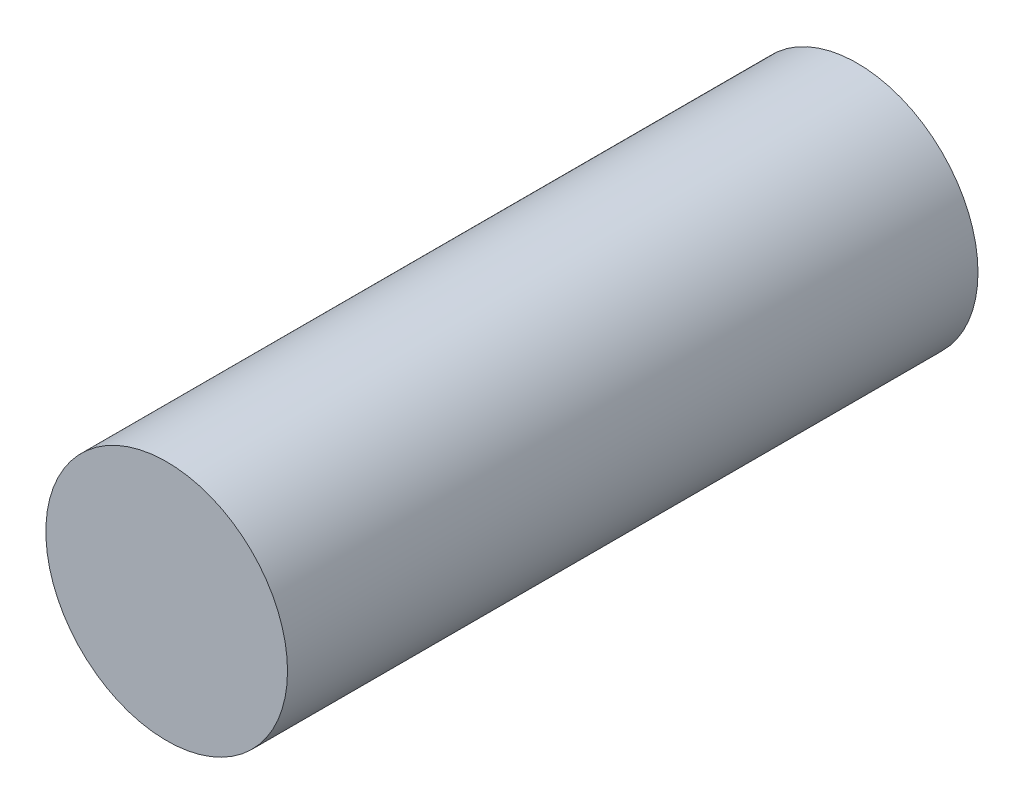
ISO-10303-21;
HEADER;
FILE_DESCRIPTION(('STEP AP214'),'2;1');
FILE_NAME('part.step','',(''),(''),'','','');
FILE_SCHEMA(('AUTOMOTIVE_DESIGN { 1 0 10303 214 1 1 1 1 }'));
ENDSEC;
DATA;
#1=APPLICATION_CONTEXT('core data for automotive mechanical design processes');
#2=APPLICATION_PROTOCOL_DEFINITION('international standard','automotive_design',2000,#1);
#3=PRODUCT_CONTEXT('',#1,'mechanical');
#4=PRODUCT('Part','Part','',(#3));
#5=PRODUCT_RELATED_PRODUCT_CATEGORY('part','',(#4));
#6=PRODUCT_DEFINITION_FORMATION('','',#4);
#7=PRODUCT_DEFINITION_CONTEXT('part definition',#1,'design');
#8=PRODUCT_DEFINITION('design','',#6,#7);
#9=PRODUCT_DEFINITION_SHAPE('','',#8);
#10=(LENGTH_UNIT() NAMED_UNIT(*) SI_UNIT(.MILLI.,.METRE.));
#11=(NAMED_UNIT(*) PLANE_ANGLE_UNIT() SI_UNIT($,.RADIAN.));
#12=(NAMED_UNIT(*) SI_UNIT($,.STERADIAN.) SOLID_ANGLE_UNIT());
#13=UNCERTAINTY_MEASURE_WITH_UNIT(LENGTH_MEASURE(1.E-05),#10,'distance_accuracy_value','');
#14=(GEOMETRIC_REPRESENTATION_CONTEXT(3) GLOBAL_UNCERTAINTY_ASSIGNED_CONTEXT((#13)) GLOBAL_UNIT_ASSIGNED_CONTEXT((#10,
#11,#12)) REPRESENTATION_CONTEXT('',''));
#15=CARTESIAN_POINT('',(0.,0.,0.));
#16=DIRECTION('',(0.,0.,1.));
#17=DIRECTION('',(1.,0.,0.));
#18=AXIS2_PLACEMENT_3D('',#15,#16,#17);
#19=CARTESIAN_POINT('',(0.,0.,20.));
#20=DIRECTION('',(0.,0.,-1.));
#21=DIRECTION('',(-1.,0.,0.));
#22=AXIS2_PLACEMENT_3D('',#19,#20,#21);
#23=CYLINDRICAL_SURFACE('',#22,3.5);
#24=CARTESIAN_POINT('',(0.,0.,20.));
#25=DIRECTION('',(0.,0.,1.));
#26=DIRECTION('',(1.,0.,0.));
#27=AXIS2_PLACEMENT_3D('',#24,#25,#26);
#28=CIRCLE('',#27,3.5);
#29=CARTESIAN_POINT('',(3.5,0.,20.));
#30=VERTEX_POINT('',#29);
#31=EDGE_CURVE('E11',#30,#30,#28,.T.);
#32=ORIENTED_EDGE('',*,*,#31,.F.);
#33=EDGE_LOOP('',(#32));
#34=FACE_BOUND('',#33,.T.);
#35=CARTESIAN_POINT('',(0.,0.,0.));
#36=DIRECTION('',(0.,0.,1.));
#37=DIRECTION('',(1.,0.,0.));
#38=AXIS2_PLACEMENT_3D('',#35,#36,#37);
#39=CIRCLE('',#38,3.5);
#40=CARTESIAN_POINT('',(3.5,0.,0.));
#41=VERTEX_POINT('',#40);
#42=EDGE_CURVE('E36',#41,#41,#39,.T.);
#43=ORIENTED_EDGE('',*,*,#42,.T.);
#44=EDGE_LOOP('',(#43));
#45=FACE_BOUND('',#44,.T.);
#46=ADVANCED_FACE('F33',(#34,#45),#23,.T.);
#47=CARTESIAN_POINT('',(0.,0.,20.));
#48=DIRECTION('',(0.,0.,1.));
#49=DIRECTION('',(1.,0.,0.));
#50=AXIS2_PLACEMENT_3D('',#47,#48,#49);
#51=PLANE('',#50);
#52=ORIENTED_EDGE('',*,*,#31,.T.);
#53=EDGE_LOOP('',(#52));
#54=FACE_BOUND('',#53,.T.);
#55=ADVANCED_FACE('F86',(#54),#51,.T.);
#56=CARTESIAN_POINT('',(0.,0.,0.));
#57=DIRECTION('',(0.,0.,1.));
#58=DIRECTION('',(1.,0.,0.));
#59=AXIS2_PLACEMENT_3D('',#56,#57,#58);
#60=PLANE('',#59);
#61=DIRECTION('',(1.,0.,0.));
#62=VECTOR('',#61,1.);
#63=CARTESIAN_POINT('',(1.39824890488067,1.43,0.));
#64=LINE('',#63,#62);
#65=CARTESIAN_POINT('',(-1.39824890488067,1.43,0.));
#66=VERTEX_POINT('',#65);
#67=CARTESIAN_POINT('',(1.39824890488067,1.43,0.));
#68=VERTEX_POINT('',#67);
#69=EDGE_CURVE('E66',#66,#68,#64,.T.);
#70=ORIENTED_EDGE('',*,*,#69,.F.);
#71=CARTESIAN_POINT('',(0.,0.,0.));
#72=DIRECTION('',(0.,0.,-1.));
#73=DIRECTION('',(-1.,0.,0.));
#74=AXIS2_PLACEMENT_3D('',#71,#72,#73);
#75=CIRCLE('',#74,2.);
#76=EDGE_CURVE('E47',#68,#66,#75,.T.);
#77=ORIENTED_EDGE('',*,*,#76,.F.);
#78=EDGE_LOOP('',(#70,#77));
#79=FACE_BOUND('',#78,.T.);
#80=ORIENTED_EDGE('',*,*,#42,.F.);
#81=EDGE_LOOP('',(#80));
#82=FACE_BOUND('',#81,.T.);
#83=ADVANCED_FACE('F70',(#79,#82),#60,.F.);
#84=CARTESIAN_POINT('',(0.,0.,10.));
#85=DIRECTION('',(0.,0.,-1.));
#86=DIRECTION('',(-1.,0.,0.));
#87=AXIS2_PLACEMENT_3D('',#84,#85,#86);
#88=CYLINDRICAL_SURFACE('',#87,2.);
#89=ORIENTED_EDGE('',*,*,#76,.T.);
#90=DIRECTION('',(0.,0.,-1.));
#91=VECTOR('',#90,1.);
#92=CARTESIAN_POINT('',(-1.39824890488067,1.43,10.));
#93=LINE('',#92,#91);
#94=CARTESIAN_POINT('',(-1.39824890488067,1.43,10.));
#95=VERTEX_POINT('',#94);
#96=EDGE_CURVE('E63',#95,#66,#93,.T.);
#97=ORIENTED_EDGE('',*,*,#96,.F.);
#98=CARTESIAN_POINT('',(0.,0.,10.));
#99=DIRECTION('',(0.,0.,-1.));
#100=DIRECTION('',(-1.,0.,0.));
#101=AXIS2_PLACEMENT_3D('',#98,#99,#100);
#102=CIRCLE('',#101,2.);
#103=CARTESIAN_POINT('',(1.39824890488067,1.43,10.));
#104=VERTEX_POINT('',#103);
#105=EDGE_CURVE('E61',#104,#95,#102,.T.);
#106=ORIENTED_EDGE('',*,*,#105,.F.);
#107=DIRECTION('',(0.,0.,-1.));
#108=VECTOR('',#107,1.);
#109=CARTESIAN_POINT('',(1.39824890488067,1.43,10.));
#110=LINE('',#109,#108);
#111=EDGE_CURVE('E55',#104,#68,#110,.T.);
#112=ORIENTED_EDGE('',*,*,#111,.T.);
#113=EDGE_LOOP('',(#89,#97,#106,#112));
#114=FACE_BOUND('',#113,.T.);
#115=ADVANCED_FACE('F59',(#114),#88,.F.);
#116=CARTESIAN_POINT('',(1.39824890488067,1.43,10.));
#117=DIRECTION('',(0.,1.,0.));
#118=DIRECTION('',(0.,0.,1.));
#119=AXIS2_PLACEMENT_3D('',#116,#117,#118);
#120=PLANE('',#119);
#121=ORIENTED_EDGE('',*,*,#69,.T.);
#122=ORIENTED_EDGE('',*,*,#111,.F.);
#123=DIRECTION('',(1.,0.,0.));
#124=VECTOR('',#123,1.);
#125=CARTESIAN_POINT('',(1.39824890488067,1.43,10.));
#126=LINE('',#125,#124);
#127=EDGE_CURVE('E74',#95,#104,#126,.T.);
#128=ORIENTED_EDGE('',*,*,#127,.F.);
#129=ORIENTED_EDGE('',*,*,#96,.T.);
#130=EDGE_LOOP('',(#121,#122,#128,#129));
#131=FACE_BOUND('',#130,.T.);
#132=ADVANCED_FACE('F67',(#131),#120,.F.);
#133=CARTESIAN_POINT('',(0.,0.,10.));
#134=DIRECTION('',(0.,0.,-1.));
#135=DIRECTION('',(-1.,0.,0.));
#136=AXIS2_PLACEMENT_3D('',#133,#134,#135);
#137=PLANE('',#136);
#138=ORIENTED_EDGE('',*,*,#105,.T.);
#139=ORIENTED_EDGE('',*,*,#127,.T.);
#140=EDGE_LOOP('',(#138,#139));
#141=FACE_BOUND('',#140,.T.);
#142=ADVANCED_FACE('F78',(#141),#137,.T.);
#143=CLOSED_SHELL('',(#46,#55,#83,#115,#132,#142));
#144=MANIFOLD_SOLID_BREP('B2',#143);
#145=ADVANCED_BREP_SHAPE_REPRESENTATION('',(#18,#144),#14);
#146=SHAPE_DEFINITION_REPRESENTATION(#9,#145);
ENDSEC;
END-ISO-10303-21;
